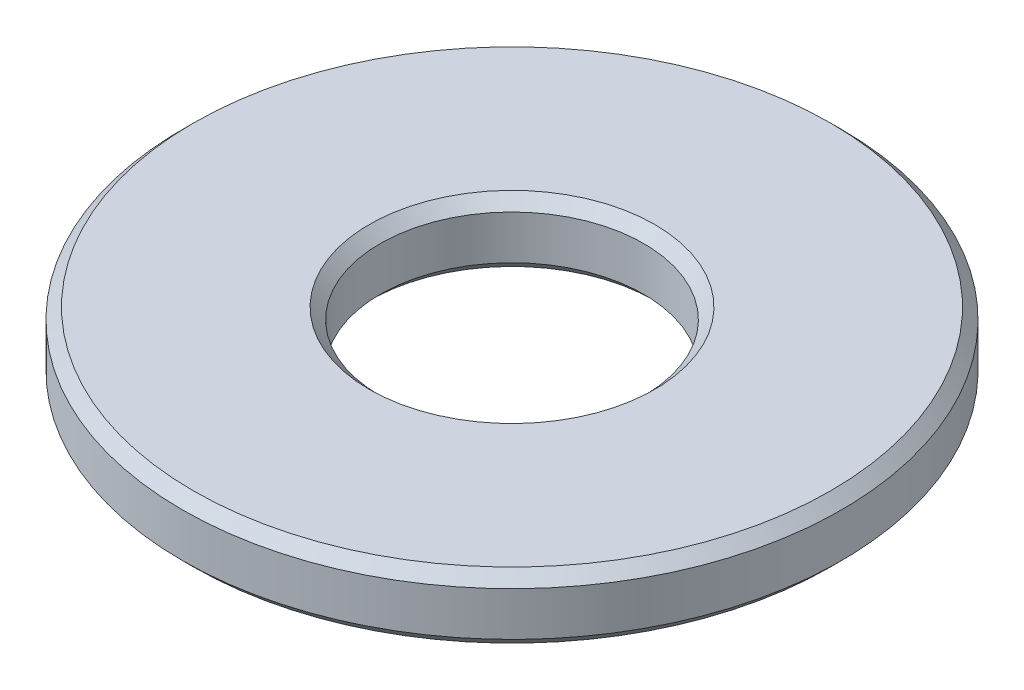
ISO-10303-21;
HEADER;
FILE_DESCRIPTION(('STEP AP214'),'2;1');
FILE_NAME('part.step','',(''),(''),'','','');
FILE_SCHEMA(('AUTOMOTIVE_DESIGN { 1 0 10303 214 1 1 1 1 }'));
ENDSEC;
DATA;
#1=APPLICATION_CONTEXT('core data for automotive mechanical design processes');
#2=APPLICATION_PROTOCOL_DEFINITION('international standard','automotive_design',2000,#1);
#3=PRODUCT_CONTEXT('',#1,'mechanical');
#4=PRODUCT('Part','Part','',(#3));
#5=PRODUCT_RELATED_PRODUCT_CATEGORY('part','',(#4));
#6=PRODUCT_DEFINITION_FORMATION('','',#4);
#7=PRODUCT_DEFINITION_CONTEXT('part definition',#1,'design');
#8=PRODUCT_DEFINITION('design','',#6,#7);
#9=PRODUCT_DEFINITION_SHAPE('','',#8);
#10=(LENGTH_UNIT() NAMED_UNIT(*) SI_UNIT(.MILLI.,.METRE.));
#11=(NAMED_UNIT(*) PLANE_ANGLE_UNIT() SI_UNIT($,.RADIAN.));
#12=(NAMED_UNIT(*) SI_UNIT($,.STERADIAN.) SOLID_ANGLE_UNIT());
#13=UNCERTAINTY_MEASURE_WITH_UNIT(LENGTH_MEASURE(1.E-05),#10,'distance_accuracy_value','');
#14=(GEOMETRIC_REPRESENTATION_CONTEXT(3) GLOBAL_UNCERTAINTY_ASSIGNED_CONTEXT((#13)) GLOBAL_UNIT_ASSIGNED_CONTEXT((#10,
#11,#12)) REPRESENTATION_CONTEXT('',''));
#15=CARTESIAN_POINT('',(0.,0.,0.));
#16=DIRECTION('',(0.,0.,1.));
#17=DIRECTION('',(1.,0.,0.));
#18=AXIS2_PLACEMENT_3D('',#15,#16,#17);
#19=CARTESIAN_POINT('',(0.,3.,0.));
#20=DIRECTION('',(0.,1.,0.));
#21=DIRECTION('',(0.,0.,1.));
#22=AXIS2_PLACEMENT_3D('',#19,#20,#21);
#23=PLANE('',#22);
#24=CARTESIAN_POINT('',(0.,3.,0.));
#25=DIRECTION('',(0.,1.,0.));
#26=DIRECTION('',(0.,0.,1.));
#27=AXIS2_PLACEMENT_3D('',#24,#25,#26);
#28=CIRCLE('',#27,6.50000000000001);
#29=CARTESIAN_POINT('',(0.,3.,6.50000000000001));
#30=VERTEX_POINT('',#29);
#31=EDGE_CURVE('E10',#30,#30,#28,.F.);
#32=ORIENTED_EDGE('',*,*,#31,.T.);
#33=EDGE_LOOP('',(#32));
#34=FACE_BOUND('',#33,.T.);
#35=CARTESIAN_POINT('',(0.,3.,0.));
#36=DIRECTION('',(0.,1.,0.));
#37=DIRECTION('',(0.,0.,1.));
#38=AXIS2_PLACEMENT_3D('',#35,#36,#37);
#39=CIRCLE('',#38,14.5);
#40=CARTESIAN_POINT('',(0.,3.,14.5));
#41=VERTEX_POINT('',#40);
#42=EDGE_CURVE('E48',#41,#41,#39,.T.);
#43=ORIENTED_EDGE('',*,*,#42,.T.);
#44=EDGE_LOOP('',(#43));
#45=FACE_BOUND('',#44,.T.);
#46=ADVANCED_FACE('F39',(#34,#45),#23,.T.);
#47=CARTESIAN_POINT('',(0.,0.,0.));
#48=DIRECTION('',(0.,1.,0.));
#49=DIRECTION('',(0.,0.,1.));
#50=AXIS2_PLACEMENT_3D('',#47,#48,#49);
#51=PLANE('',#50);
#52=CARTESIAN_POINT('',(0.,0.,0.));
#53=DIRECTION('',(0.,1.,0.));
#54=DIRECTION('',(0.,0.,1.));
#55=AXIS2_PLACEMENT_3D('',#52,#53,#54);
#56=CIRCLE('',#55,6.5);
#57=CARTESIAN_POINT('',(0.,0.,6.5));
#58=VERTEX_POINT('',#57);
#59=EDGE_CURVE('E72',#58,#58,#56,.T.);
#60=ORIENTED_EDGE('',*,*,#59,.T.);
#61=EDGE_LOOP('',(#60));
#62=FACE_BOUND('',#61,.T.);
#63=CARTESIAN_POINT('',(0.,0.,0.));
#64=DIRECTION('',(0.,1.,0.));
#65=DIRECTION('',(0.,0.,1.));
#66=AXIS2_PLACEMENT_3D('',#63,#64,#65);
#67=CIRCLE('',#66,14.5);
#68=CARTESIAN_POINT('',(0.,0.,14.5));
#69=VERTEX_POINT('',#68);
#70=EDGE_CURVE('E76',#69,#69,#67,.F.);
#71=ORIENTED_EDGE('',*,*,#70,.T.);
#72=EDGE_LOOP('',(#71));
#73=FACE_BOUND('',#72,.T.);
#74=ADVANCED_FACE('F81',(#62,#73),#51,.F.);
#75=CARTESIAN_POINT('',(0.,3.,0.));
#76=DIRECTION('',(0.,-1.,0.));
#77=DIRECTION('',(0.,0.,-1.));
#78=AXIS2_PLACEMENT_3D('',#75,#76,#77);
#79=CYLINDRICAL_SURFACE('',#78,15.);
#80=CARTESIAN_POINT('',(0.,0.500000000000002,0.));
#81=DIRECTION('',(0.,1.,0.));
#82=DIRECTION('',(0.,0.,1.));
#83=AXIS2_PLACEMENT_3D('',#80,#81,#82);
#84=CIRCLE('',#83,15.);
#85=CARTESIAN_POINT('',(0.,0.500000000000002,15.));
#86=VERTEX_POINT('',#85);
#87=EDGE_CURVE('E53',#86,#86,#84,.T.);
#88=ORIENTED_EDGE('',*,*,#87,.T.);
#89=EDGE_LOOP('',(#88));
#90=FACE_BOUND('',#89,.T.);
#91=CARTESIAN_POINT('',(0.,2.5,0.));
#92=DIRECTION('',(0.,1.,0.));
#93=DIRECTION('',(0.,0.,1.));
#94=AXIS2_PLACEMENT_3D('',#91,#92,#93);
#95=CIRCLE('',#94,15.);
#96=CARTESIAN_POINT('',(0.,2.5,15.));
#97=VERTEX_POINT('',#96);
#98=EDGE_CURVE('E58',#97,#97,#95,.F.);
#99=ORIENTED_EDGE('',*,*,#98,.T.);
#100=EDGE_LOOP('',(#99));
#101=FACE_BOUND('',#100,.T.);
#102=ADVANCED_FACE('F91',(#90,#101),#79,.T.);
#103=CARTESIAN_POINT('',(0.,3.,0.));
#104=DIRECTION('',(0.,-1.,0.));
#105=DIRECTION('',(0.,0.,-1.));
#106=AXIS2_PLACEMENT_3D('',#103,#104,#105);
#107=CYLINDRICAL_SURFACE('',#106,6.);
#108=CARTESIAN_POINT('',(0.,0.5,0.));
#109=DIRECTION('',(0.,1.,0.));
#110=DIRECTION('',(0.,0.,1.));
#111=AXIS2_PLACEMENT_3D('',#108,#109,#110);
#112=CIRCLE('',#111,6.);
#113=CARTESIAN_POINT('',(0.,0.5,6.));
#114=VERTEX_POINT('',#113);
#115=EDGE_CURVE('E64',#114,#114,#112,.F.);
#116=ORIENTED_EDGE('',*,*,#115,.T.);
#117=EDGE_LOOP('',(#116));
#118=FACE_BOUND('',#117,.T.);
#119=CARTESIAN_POINT('',(0.,2.5,0.));
#120=DIRECTION('',(0.,1.,0.));
#121=DIRECTION('',(0.,0.,1.));
#122=AXIS2_PLACEMENT_3D('',#119,#120,#121);
#123=CIRCLE('',#122,6.);
#124=CARTESIAN_POINT('',(0.,2.5,6.));
#125=VERTEX_POINT('',#124);
#126=EDGE_CURVE('E68',#125,#125,#123,.T.);
#127=ORIENTED_EDGE('',*,*,#126,.T.);
#128=EDGE_LOOP('',(#127));
#129=FACE_BOUND('',#128,.T.);
#130=ADVANCED_FACE('F94',(#118,#129),#107,.F.);
#131=CARTESIAN_POINT('',(0.,0.,0.));
#132=DIRECTION('',(0.,-1.,0.));
#133=DIRECTION('',(0.,0.,-1.));
#134=AXIS2_PLACEMENT_3D('',#131,#132,#133);
#135=CONICAL_SURFACE('',#134,6.5,0.785398163397446);
#136=ORIENTED_EDGE('',*,*,#115,.F.);
#137=EDGE_LOOP('',(#136));
#138=FACE_BOUND('',#137,.T.);
#139=ORIENTED_EDGE('',*,*,#59,.F.);
#140=EDGE_LOOP('',(#139));
#141=FACE_BOUND('',#140,.T.);
#142=ADVANCED_FACE('F87',(#138,#141),#135,.F.);
#143=CARTESIAN_POINT('',(0.,0.500000000000002,0.));
#144=DIRECTION('',(0.,1.,0.));
#145=DIRECTION('',(0.,0.,1.));
#146=AXIS2_PLACEMENT_3D('',#143,#144,#145);
#147=CONICAL_SURFACE('',#146,15.,0.78539816339745);
#148=ORIENTED_EDGE('',*,*,#70,.F.);
#149=EDGE_LOOP('',(#148));
#150=FACE_BOUND('',#149,.T.);
#151=ORIENTED_EDGE('',*,*,#87,.F.);
#152=EDGE_LOOP('',(#151));
#153=FACE_BOUND('',#152,.T.);
#154=ADVANCED_FACE('F83',(#150,#153),#147,.T.);
#155=CARTESIAN_POINT('',(0.,2.5,0.));
#156=DIRECTION('',(0.,1.,0.));
#157=DIRECTION('',(0.,0.,1.));
#158=AXIS2_PLACEMENT_3D('',#155,#156,#157);
#159=CONICAL_SURFACE('',#158,6.,0.785398163397452);
#160=ORIENTED_EDGE('',*,*,#31,.F.);
#161=EDGE_LOOP('',(#160));
#162=FACE_BOUND('',#161,.T.);
#163=ORIENTED_EDGE('',*,*,#126,.F.);
#164=EDGE_LOOP('',(#163));
#165=FACE_BOUND('',#164,.T.);
#166=ADVANCED_FACE('F86',(#162,#165),#159,.F.);
#167=CARTESIAN_POINT('',(0.,3.,0.));
#168=DIRECTION('',(0.,-1.,0.));
#169=DIRECTION('',(0.,0.,-1.));
#170=AXIS2_PLACEMENT_3D('',#167,#168,#169);
#171=CONICAL_SURFACE('',#170,14.5,0.785398163397443);
#172=ORIENTED_EDGE('',*,*,#98,.F.);
#173=EDGE_LOOP('',(#172));
#174=FACE_BOUND('',#173,.T.);
#175=ORIENTED_EDGE('',*,*,#42,.F.);
#176=EDGE_LOOP('',(#175));
#177=FACE_BOUND('',#176,.T.);
#178=ADVANCED_FACE('F42',(#174,#177),#171,.T.);
#179=CLOSED_SHELL('',(#46,#74,#102,#130,#142,#154,#166,#178));
#180=MANIFOLD_SOLID_BREP('B2',#179);
#181=ADVANCED_BREP_SHAPE_REPRESENTATION('',(#18,#180),#14);
#182=SHAPE_DEFINITION_REPRESENTATION(#9,#181);
ENDSEC;
END-ISO-10303-21;
